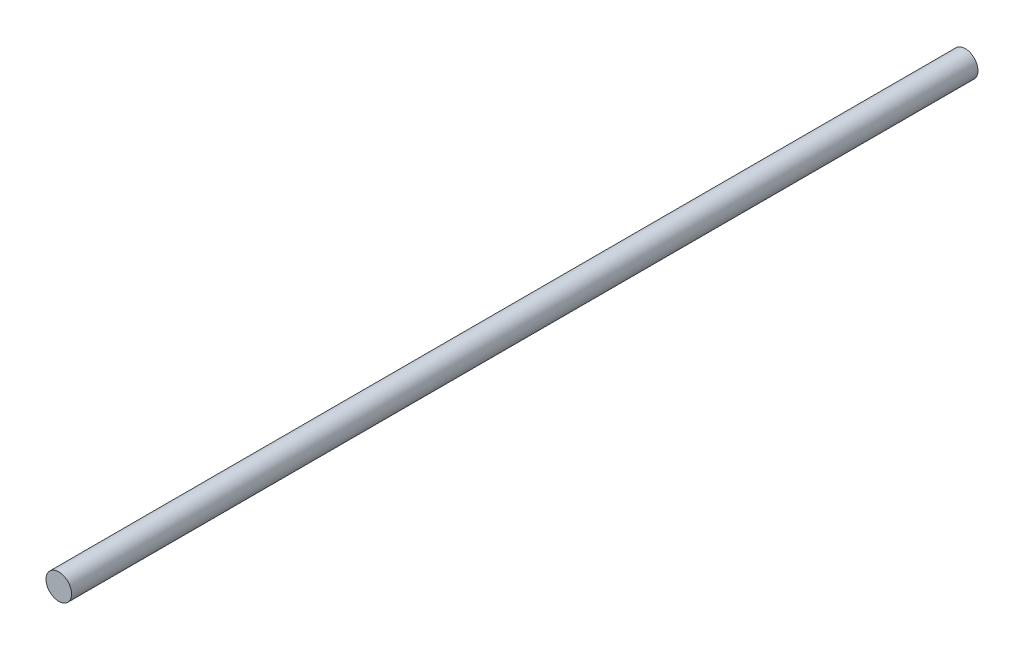
ISO-10303-21;
HEADER;
FILE_DESCRIPTION(('STEP AP214'),'2;1');
FILE_NAME('part.step','',(''),(''),'','','');
FILE_SCHEMA(('AUTOMOTIVE_DESIGN { 1 0 10303 214 1 1 1 1 }'));
ENDSEC;
DATA;
#1=APPLICATION_CONTEXT('core data for automotive mechanical design processes');
#2=APPLICATION_PROTOCOL_DEFINITION('international standard','automotive_design',2000,#1);
#3=PRODUCT_CONTEXT('',#1,'mechanical');
#4=PRODUCT('Part','Part','',(#3));
#5=PRODUCT_RELATED_PRODUCT_CATEGORY('part','',(#4));
#6=PRODUCT_DEFINITION_FORMATION('','',#4);
#7=PRODUCT_DEFINITION_CONTEXT('part definition',#1,'design');
#8=PRODUCT_DEFINITION('design','',#6,#7);
#9=PRODUCT_DEFINITION_SHAPE('','',#8);
#10=(LENGTH_UNIT() NAMED_UNIT(*) SI_UNIT(.MILLI.,.METRE.));
#11=(NAMED_UNIT(*) PLANE_ANGLE_UNIT() SI_UNIT($,.RADIAN.));
#12=(NAMED_UNIT(*) SI_UNIT($,.STERADIAN.) SOLID_ANGLE_UNIT());
#13=UNCERTAINTY_MEASURE_WITH_UNIT(LENGTH_MEASURE(1.E-05),#10,'distance_accuracy_value','');
#14=(GEOMETRIC_REPRESENTATION_CONTEXT(3) GLOBAL_UNCERTAINTY_ASSIGNED_CONTEXT((#13)) GLOBAL_UNIT_ASSIGNED_CONTEXT((#10,
#11,#12)) REPRESENTATION_CONTEXT('',''));
#15=CARTESIAN_POINT('',(0.,0.,0.));
#16=DIRECTION('',(0.,0.,1.));
#17=DIRECTION('',(1.,0.,0.));
#18=AXIS2_PLACEMENT_3D('',#15,#16,#17);
#19=CARTESIAN_POINT('',(0.,0.,885.));
#20=DIRECTION('',(0.,0.,-1.));
#21=DIRECTION('',(-1.,0.,0.));
#22=AXIS2_PLACEMENT_3D('',#19,#20,#21);
#23=CYLINDRICAL_SURFACE('',#22,12.5);
#24=CARTESIAN_POINT('',(0.,0.,885.));
#25=DIRECTION('',(0.,0.,1.));
#26=DIRECTION('',(1.,0.,0.));
#27=AXIS2_PLACEMENT_3D('',#24,#25,#26);
#28=CIRCLE('',#27,12.5);
#29=CARTESIAN_POINT('',(12.5,0.,885.));
#30=VERTEX_POINT('',#29);
#31=EDGE_CURVE('E10',#30,#30,#28,.T.);
#32=ORIENTED_EDGE('',*,*,#31,.F.);
#33=EDGE_LOOP('',(#32));
#34=FACE_BOUND('',#33,.T.);
#35=CARTESIAN_POINT('',(0.,0.,0.));
#36=DIRECTION('',(0.,0.,1.));
#37=DIRECTION('',(1.,0.,0.));
#38=AXIS2_PLACEMENT_3D('',#35,#36,#37);
#39=CIRCLE('',#38,12.5);
#40=CARTESIAN_POINT('',(12.5,0.,0.));
#41=VERTEX_POINT('',#40);
#42=EDGE_CURVE('E40',#41,#41,#39,.T.);
#43=ORIENTED_EDGE('',*,*,#42,.T.);
#44=EDGE_LOOP('',(#43));
#45=FACE_BOUND('',#44,.T.);
#46=ADVANCED_FACE('F37',(#34,#45),#23,.T.);
#47=CARTESIAN_POINT('',(0.,0.,885.));
#48=DIRECTION('',(0.,0.,1.));
#49=DIRECTION('',(1.,0.,0.));
#50=AXIS2_PLACEMENT_3D('',#47,#48,#49);
#51=PLANE('',#50);
#52=ORIENTED_EDGE('',*,*,#31,.T.);
#53=EDGE_LOOP('',(#52));
#54=FACE_BOUND('',#53,.T.);
#55=ADVANCED_FACE('F54',(#54),#51,.T.);
#56=CARTESIAN_POINT('',(0.,0.,0.));
#57=DIRECTION('',(0.,0.,1.));
#58=DIRECTION('',(1.,0.,0.));
#59=AXIS2_PLACEMENT_3D('',#56,#57,#58);
#60=PLANE('',#59);
#61=ORIENTED_EDGE('',*,*,#42,.F.);
#62=EDGE_LOOP('',(#61));
#63=FACE_BOUND('',#62,.T.);
#64=ADVANCED_FACE('F52',(#63),#60,.F.);
#65=CLOSED_SHELL('',(#46,#55,#64));
#66=MANIFOLD_SOLID_BREP('B2',#65);
#67=ADVANCED_BREP_SHAPE_REPRESENTATION('',(#18,#66),#14);
#68=SHAPE_DEFINITION_REPRESENTATION(#9,#67);
ENDSEC;
END-ISO-10303-21;
